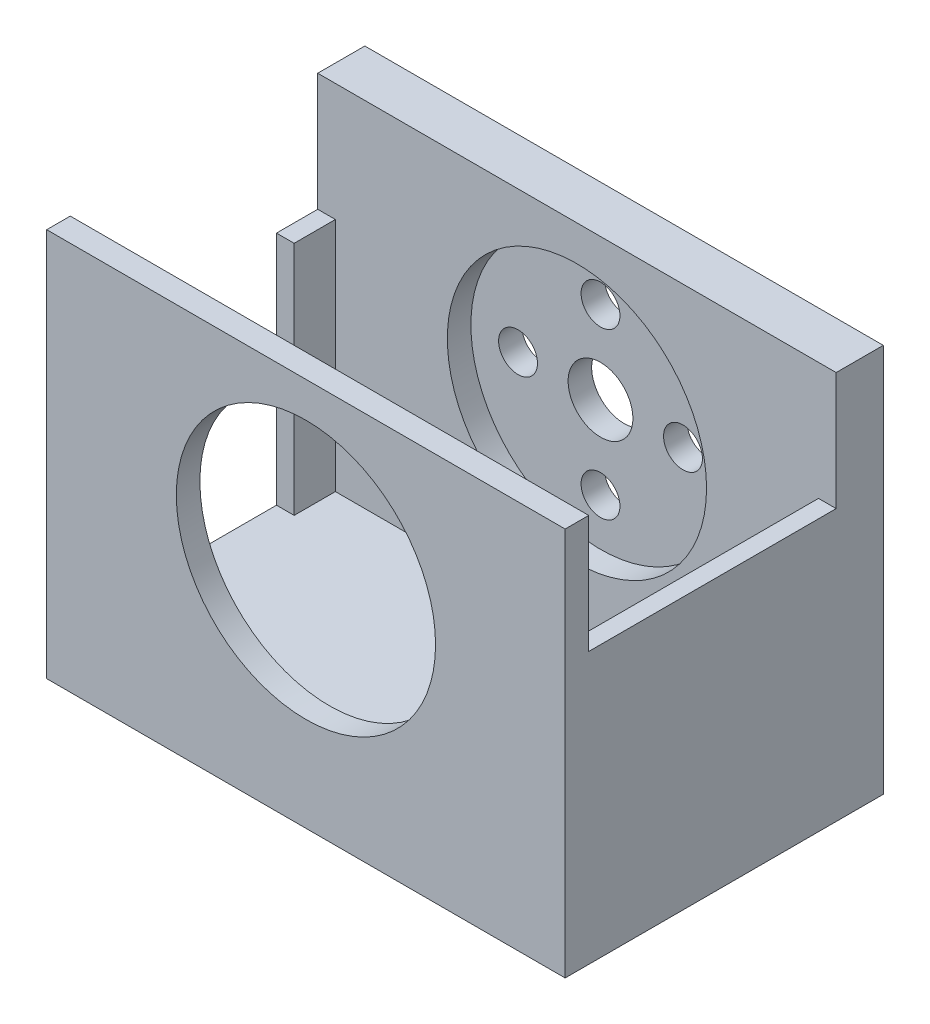
ISO-10303-21;
HEADER;
FILE_DESCRIPTION(('STEP AP214'),'2;1');
FILE_NAME('part.step','',(''),(''),'','','');
FILE_SCHEMA(('AUTOMOTIVE_DESIGN { 1 0 10303 214 1 1 1 1 }'));
ENDSEC;
DATA;
#1=APPLICATION_CONTEXT('core data for automotive mechanical design processes');
#2=APPLICATION_PROTOCOL_DEFINITION('international standard','automotive_design',2000,#1);
#3=PRODUCT_CONTEXT('',#1,'mechanical');
#4=PRODUCT('Part','Part','',(#3));
#5=PRODUCT_RELATED_PRODUCT_CATEGORY('part','',(#4));
#6=PRODUCT_DEFINITION_FORMATION('','',#4);
#7=PRODUCT_DEFINITION_CONTEXT('part definition',#1,'design');
#8=PRODUCT_DEFINITION('design','',#6,#7);
#9=PRODUCT_DEFINITION_SHAPE('','',#8);
#10=(LENGTH_UNIT() NAMED_UNIT(*) SI_UNIT(.MILLI.,.METRE.));
#11=(NAMED_UNIT(*) PLANE_ANGLE_UNIT() SI_UNIT($,.RADIAN.));
#12=(NAMED_UNIT(*) SI_UNIT($,.STERADIAN.) SOLID_ANGLE_UNIT());
#13=UNCERTAINTY_MEASURE_WITH_UNIT(LENGTH_MEASURE(1.E-05),#10,'distance_accuracy_value','');
#14=(GEOMETRIC_REPRESENTATION_CONTEXT(3) GLOBAL_UNCERTAINTY_ASSIGNED_CONTEXT((#13)) GLOBAL_UNIT_ASSIGNED_CONTEXT((#10,
#11,#12)) REPRESENTATION_CONTEXT('',''));
#15=CARTESIAN_POINT('',(0.,0.,0.));
#16=DIRECTION('',(0.,0.,1.));
#17=DIRECTION('',(1.,0.,0.));
#18=AXIS2_PLACEMENT_3D('',#15,#16,#17);
#19=CARTESIAN_POINT('',(0.,23.,0.));
#20=DIRECTION('',(0.,1.,0.));
#21=DIRECTION('',(0.,0.,1.));
#22=AXIS2_PLACEMENT_3D('',#19,#20,#21);
#23=PLANE('',#22);
#24=DIRECTION('',(1.,0.,0.));
#25=VECTOR('',#24,1.);
#26=CARTESIAN_POINT('',(0.,23.,11.5));
#27=LINE('',#26,#25);
#28=CARTESIAN_POINT('',(20.5,23.,11.5));
#29=VERTEX_POINT('',#28);
#30=CARTESIAN_POINT('',(22.,23.,11.5));
#31=VERTEX_POINT('',#30);
#32=EDGE_CURVE('E72',#29,#31,#27,.T.);
#33=ORIENTED_EDGE('',*,*,#32,.T.);
#34=DIRECTION('',(0.,0.,-1.));
#35=VECTOR('',#34,1.);
#36=CARTESIAN_POINT('',(22.,23.,-13.5));
#37=LINE('',#36,#35);
#38=CARTESIAN_POINT('',(22.,23.,-9.5));
#39=VERTEX_POINT('',#38);
#40=EDGE_CURVE('E298',#31,#39,#37,.T.);
#41=ORIENTED_EDGE('',*,*,#40,.T.);
#42=DIRECTION('',(-1.,0.,0.));
#43=VECTOR('',#42,1.);
#44=CARTESIAN_POINT('',(0.,23.,-9.5));
#45=LINE('',#44,#43);
#46=CARTESIAN_POINT('',(20.5,23.,-9.5));
#47=VERTEX_POINT('',#46);
#48=EDGE_CURVE('E57',#39,#47,#45,.T.);
#49=ORIENTED_EDGE('',*,*,#48,.T.);
#50=DIRECTION('',(0.,0.,1.));
#51=VECTOR('',#50,1.);
#52=CARTESIAN_POINT('',(20.5,23.,0.));
#53=LINE('',#52,#51);
#54=EDGE_CURVE('E263',#47,#29,#53,.T.);
#55=ORIENTED_EDGE('',*,*,#54,.T.);
#56=EDGE_LOOP('',(#33,#41,#49,#55));
#57=FACE_BOUND('',#56,.T.);
#58=ADVANCED_FACE('F45',(#57),#23,.T.);
#59=CARTESIAN_POINT('',(-22.,23.,11.5));
#60=VERTEX_POINT('',#59);
#61=CARTESIAN_POINT('',(-20.5,23.,11.5));
#62=VERTEX_POINT('',#61);
#63=EDGE_CURVE('E170',#60,#62,#27,.T.);
#64=ORIENTED_EDGE('',*,*,#63,.T.);
#65=DIRECTION('',(0.,0.,-1.));
#66=VECTOR('',#65,1.);
#67=CARTESIAN_POINT('',(-20.5,23.,0.));
#68=LINE('',#67,#66);
#69=CARTESIAN_POINT('',(-20.5,23.,8.));
#70=VERTEX_POINT('',#69);
#71=EDGE_CURVE('E275',#62,#70,#68,.T.);
#72=ORIENTED_EDGE('',*,*,#71,.T.);
#73=DIRECTION('',(1.,0.,0.));
#74=VECTOR('',#73,1.);
#75=CARTESIAN_POINT('',(-40.5,23.,8.));
#76=LINE('',#75,#74);
#77=CARTESIAN_POINT('',(-22.,23.,8.));
#78=VERTEX_POINT('',#77);
#79=EDGE_CURVE('E232',#78,#70,#76,.T.);
#80=ORIENTED_EDGE('',*,*,#79,.F.);
#81=DIRECTION('',(0.,0.,1.));
#82=VECTOR('',#81,1.);
#83=CARTESIAN_POINT('',(-22.,23.,-13.5));
#84=LINE('',#83,#82);
#85=EDGE_CURVE('E64',#78,#60,#84,.T.);
#86=ORIENTED_EDGE('',*,*,#85,.T.);
#87=EDGE_LOOP('',(#64,#72,#80,#86));
#88=FACE_BOUND('',#87,.T.);
#89=ADVANCED_FACE('F404',(#88),#23,.T.);
#90=CARTESIAN_POINT('',(-20.5,23.,-6.));
#91=VERTEX_POINT('',#90);
#92=CARTESIAN_POINT('',(-20.5,23.,-9.5));
#93=VERTEX_POINT('',#92);
#94=EDGE_CURVE('E257',#91,#93,#68,.T.);
#95=ORIENTED_EDGE('',*,*,#94,.T.);
#96=CARTESIAN_POINT('',(-22.,23.,-9.5));
#97=VERTEX_POINT('',#96);
#98=EDGE_CURVE('E11',#93,#97,#45,.T.);
#99=ORIENTED_EDGE('',*,*,#98,.T.);
#100=CARTESIAN_POINT('',(-22.,23.,-6.));
#101=VERTEX_POINT('',#100);
#102=EDGE_CURVE('E295',#97,#101,#84,.T.);
#103=ORIENTED_EDGE('',*,*,#102,.T.);
#104=DIRECTION('',(1.,0.,0.));
#105=VECTOR('',#104,1.);
#106=CARTESIAN_POINT('',(-40.5,23.,-6.));
#107=LINE('',#106,#105);
#108=EDGE_CURVE('E236',#101,#91,#107,.T.);
#109=ORIENTED_EDGE('',*,*,#108,.T.);
#110=EDGE_LOOP('',(#95,#99,#103,#109));
#111=FACE_BOUND('',#110,.T.);
#112=ADVANCED_FACE('F423',(#111),#23,.T.);
#113=CARTESIAN_POINT('',(-20.5,3.,0.));
#114=DIRECTION('',(1.,0.,0.));
#115=DIRECTION('',(0.,0.,-1.));
#116=AXIS2_PLACEMENT_3D('',#113,#114,#115);
#117=PLANE('',#116);
#118=DIRECTION('',(0.,-1.,0.));
#119=VECTOR('',#118,1.);
#120=CARTESIAN_POINT('',(-20.5,3.,8.));
#121=LINE('',#120,#119);
#122=CARTESIAN_POINT('',(-20.5,3.,8.));
#123=VERTEX_POINT('',#122);
#124=EDGE_CURVE('E223',#70,#123,#121,.T.);
#125=ORIENTED_EDGE('',*,*,#124,.F.);
#126=ORIENTED_EDGE('',*,*,#71,.F.);
#127=DIRECTION('',(0.,1.,0.));
#128=VECTOR('',#127,1.);
#129=CARTESIAN_POINT('',(-20.5,3.,11.5));
#130=LINE('',#129,#128);
#131=CARTESIAN_POINT('',(-20.5,3.,11.5));
#132=VERTEX_POINT('',#131);
#133=EDGE_CURVE('E291',#132,#62,#130,.T.);
#134=ORIENTED_EDGE('',*,*,#133,.F.);
#135=DIRECTION('',(0.,0.,-1.));
#136=VECTOR('',#135,1.);
#137=CARTESIAN_POINT('',(-20.5,3.,0.));
#138=LINE('',#137,#136);
#139=EDGE_CURVE('E264',#132,#123,#138,.T.);
#140=ORIENTED_EDGE('',*,*,#139,.T.);
#141=EDGE_LOOP('',(#125,#126,#134,#140));
#142=FACE_BOUND('',#141,.T.);
#143=ADVANCED_FACE('F409',(#142),#117,.T.);
#144=CARTESIAN_POINT('',(-22.,23.,-13.5));
#145=DIRECTION('',(1.,0.,0.));
#146=DIRECTION('',(0.,0.,-1.));
#147=AXIS2_PLACEMENT_3D('',#144,#145,#146);
#148=PLANE('',#147);
#149=ORIENTED_EDGE('',*,*,#85,.F.);
#150=DIRECTION('',(0.,-1.,0.));
#151=VECTOR('',#150,1.);
#152=CARTESIAN_POINT('',(-22.,23.,8.));
#153=LINE('',#152,#151);
#154=CARTESIAN_POINT('',(-22.,3.,8.));
#155=VERTEX_POINT('',#154);
#156=EDGE_CURVE('E253',#78,#155,#153,.T.);
#157=ORIENTED_EDGE('',*,*,#156,.T.);
#158=DIRECTION('',(0.,0.,-1.));
#159=VECTOR('',#158,1.);
#160=CARTESIAN_POINT('',(-22.,3.,-13.5));
#161=LINE('',#160,#159);
#162=CARTESIAN_POINT('',(-22.,3.,-6.));
#163=VERTEX_POINT('',#162);
#164=EDGE_CURVE('E235',#155,#163,#161,.T.);
#165=ORIENTED_EDGE('',*,*,#164,.T.);
#166=DIRECTION('',(0.,1.,0.));
#167=VECTOR('',#166,1.);
#168=CARTESIAN_POINT('',(-22.,23.,-6.));
#169=LINE('',#168,#167);
#170=EDGE_CURVE('E249',#163,#101,#169,.T.);
#171=ORIENTED_EDGE('',*,*,#170,.T.);
#172=ORIENTED_EDGE('',*,*,#102,.F.);
#173=DIRECTION('',(0.,-1.,0.));
#174=VECTOR('',#173,1.);
#175=CARTESIAN_POINT('',(-22.,33.,-9.5));
#176=LINE('',#175,#174);
#177=CARTESIAN_POINT('',(-22.,33.,-9.5));
#178=VERTEX_POINT('',#177);
#179=EDGE_CURVE('E216',#178,#97,#176,.T.);
#180=ORIENTED_EDGE('',*,*,#179,.F.);
#181=DIRECTION('',(0.,0.,-1.));
#182=VECTOR('',#181,1.);
#183=CARTESIAN_POINT('',(-22.,33.,0.));
#184=LINE('',#183,#182);
#185=CARTESIAN_POINT('',(-22.,33.,-13.5));
#186=VERTEX_POINT('',#185);
#187=EDGE_CURVE('E205',#178,#186,#184,.T.);
#188=ORIENTED_EDGE('',*,*,#187,.T.);
#189=DIRECTION('',(0.,-1.,0.));
#190=VECTOR('',#189,1.);
#191=CARTESIAN_POINT('',(-22.,23.,-13.5));
#192=LINE('',#191,#190);
#193=CARTESIAN_POINT('',(-22.,0.,-13.5));
#194=VERTEX_POINT('',#193);
#195=EDGE_CURVE('E301',#186,#194,#192,.T.);
#196=ORIENTED_EDGE('',*,*,#195,.T.);
#197=DIRECTION('',(0.,0.,1.));
#198=VECTOR('',#197,1.);
#199=CARTESIAN_POINT('',(-22.,0.,-13.5));
#200=LINE('',#199,#198);
#201=CARTESIAN_POINT('',(-22.,0.,13.5));
#202=VERTEX_POINT('',#201);
#203=EDGE_CURVE('E294',#194,#202,#200,.T.);
#204=ORIENTED_EDGE('',*,*,#203,.T.);
#205=DIRECTION('',(0.,-1.,0.));
#206=VECTOR('',#205,1.);
#207=CARTESIAN_POINT('',(-22.,23.,13.5));
#208=LINE('',#207,#206);
#209=CARTESIAN_POINT('',(-22.,33.,13.5));
#210=VERTEX_POINT('',#209);
#211=EDGE_CURVE('E55',#210,#202,#208,.T.);
#212=ORIENTED_EDGE('',*,*,#211,.F.);
#213=DIRECTION('',(0.,0.,-1.));
#214=VECTOR('',#213,1.);
#215=CARTESIAN_POINT('',(-22.,33.,0.));
#216=LINE('',#215,#214);
#217=CARTESIAN_POINT('',(-22.,33.,11.5));
#218=VERTEX_POINT('',#217);
#219=EDGE_CURVE('E182',#210,#218,#216,.T.);
#220=ORIENTED_EDGE('',*,*,#219,.T.);
#221=DIRECTION('',(0.,-1.,0.));
#222=VECTOR('',#221,1.);
#223=CARTESIAN_POINT('',(-22.,33.,11.5));
#224=LINE('',#223,#222);
#225=EDGE_CURVE('E165',#218,#60,#224,.T.);
#226=ORIENTED_EDGE('',*,*,#225,.T.);
#227=EDGE_LOOP('',(#149,#157,#165,#171,#172,#180,#188,#196,#204,#212,#220,#226));
#228=FACE_BOUND('',#227,.T.);
#229=ADVANCED_FACE('F47',(#228),#148,.F.);
#230=CARTESIAN_POINT('',(-22.,23.,13.5));
#231=DIRECTION('',(0.,0.,-1.));
#232=DIRECTION('',(-1.,0.,0.));
#233=AXIS2_PLACEMENT_3D('',#230,#231,#232);
#234=PLANE('',#233);
#235=CARTESIAN_POINT('',(0.,19.,13.5));
#236=DIRECTION('',(0.,0.,1.));
#237=DIRECTION('',(1.,0.,0.));
#238=AXIS2_PLACEMENT_3D('',#235,#236,#237);
#239=CIRCLE('',#238,11.);
#240=CARTESIAN_POINT('',(11.,19.,13.5));
#241=VERTEX_POINT('',#240);
#242=EDGE_CURVE('E330',#241,#241,#239,.T.);
#243=ORIENTED_EDGE('',*,*,#242,.F.);
#244=EDGE_LOOP('',(#243));
#245=FACE_BOUND('',#244,.T.);
#246=DIRECTION('',(1.,0.,0.));
#247=VECTOR('',#246,1.);
#248=CARTESIAN_POINT('',(-22.,0.,13.5));
#249=LINE('',#248,#247);
#250=CARTESIAN_POINT('',(22.,0.,13.5));
#251=VERTEX_POINT('',#250);
#252=EDGE_CURVE('E304',#202,#251,#249,.T.);
#253=ORIENTED_EDGE('',*,*,#252,.T.);
#254=DIRECTION('',(0.,-1.,0.));
#255=VECTOR('',#254,1.);
#256=CARTESIAN_POINT('',(22.,23.,13.5));
#257=LINE('',#256,#255);
#258=CARTESIAN_POINT('',(22.,33.,13.5));
#259=VERTEX_POINT('',#258);
#260=EDGE_CURVE('E320',#259,#251,#257,.T.);
#261=ORIENTED_EDGE('',*,*,#260,.F.);
#262=DIRECTION('',(-1.,0.,0.));
#263=VECTOR('',#262,1.);
#264=CARTESIAN_POINT('',(0.,33.,13.5));
#265=LINE('',#264,#263);
#266=EDGE_CURVE('E191',#259,#210,#265,.T.);
#267=ORIENTED_EDGE('',*,*,#266,.T.);
#268=ORIENTED_EDGE('',*,*,#211,.T.);
#269=EDGE_LOOP('',(#253,#261,#267,#268));
#270=FACE_BOUND('',#269,.T.);
#271=ADVANCED_FACE('F378',(#245,#270),#234,.F.);
#272=CARTESIAN_POINT('',(22.,23.,-13.5));
#273=DIRECTION('',(-1.,0.,0.));
#274=DIRECTION('',(0.,0.,1.));
#275=AXIS2_PLACEMENT_3D('',#272,#273,#274);
#276=PLANE('',#275);
#277=DIRECTION('',(0.,0.,-1.));
#278=VECTOR('',#277,1.);
#279=CARTESIAN_POINT('',(22.,0.,-13.5));
#280=LINE('',#279,#278);
#281=CARTESIAN_POINT('',(22.,0.,-13.5));
#282=VERTEX_POINT('',#281);
#283=EDGE_CURVE('E307',#251,#282,#280,.T.);
#284=ORIENTED_EDGE('',*,*,#283,.T.);
#285=DIRECTION('',(0.,-1.,0.));
#286=VECTOR('',#285,1.);
#287=CARTESIAN_POINT('',(22.,23.,-13.5));
#288=LINE('',#287,#286);
#289=CARTESIAN_POINT('',(22.,33.,-13.5));
#290=VERTEX_POINT('',#289);
#291=EDGE_CURVE('E316',#290,#282,#288,.T.);
#292=ORIENTED_EDGE('',*,*,#291,.F.);
#293=DIRECTION('',(0.,0.,1.));
#294=VECTOR('',#293,1.);
#295=CARTESIAN_POINT('',(22.,33.,0.));
#296=LINE('',#295,#294);
#297=CARTESIAN_POINT('',(22.,33.,-9.5));
#298=VERTEX_POINT('',#297);
#299=EDGE_CURVE('E213',#290,#298,#296,.T.);
#300=ORIENTED_EDGE('',*,*,#299,.T.);
#301=DIRECTION('',(0.,-1.,0.));
#302=VECTOR('',#301,1.);
#303=CARTESIAN_POINT('',(22.,33.,-9.5));
#304=LINE('',#303,#302);
#305=EDGE_CURVE('E219',#298,#39,#304,.T.);
#306=ORIENTED_EDGE('',*,*,#305,.T.);
#307=ORIENTED_EDGE('',*,*,#40,.F.);
#308=DIRECTION('',(0.,-1.,0.));
#309=VECTOR('',#308,1.);
#310=CARTESIAN_POINT('',(22.,33.,11.5));
#311=LINE('',#310,#309);
#312=CARTESIAN_POINT('',(22.,33.,11.5));
#313=VERTEX_POINT('',#312);
#314=EDGE_CURVE('E174',#313,#31,#311,.T.);
#315=ORIENTED_EDGE('',*,*,#314,.F.);
#316=DIRECTION('',(0.,0.,1.));
#317=VECTOR('',#316,1.);
#318=CARTESIAN_POINT('',(22.,33.,0.));
#319=LINE('',#318,#317);
#320=EDGE_CURVE('E184',#313,#259,#319,.T.);
#321=ORIENTED_EDGE('',*,*,#320,.T.);
#322=ORIENTED_EDGE('',*,*,#260,.T.);
#323=EDGE_LOOP('',(#284,#292,#300,#306,#307,#315,#321,#322));
#324=FACE_BOUND('',#323,.T.);
#325=ADVANCED_FACE('F381',(#324),#276,.F.);
#326=CARTESIAN_POINT('',(-22.,23.,-13.5));
#327=DIRECTION('',(0.,0.,1.));
#328=DIRECTION('',(1.,0.,0.));
#329=AXIS2_PLACEMENT_3D('',#326,#327,#328);
#330=PLANE('',#329);
#331=CARTESIAN_POINT('',(-7.,19.,-13.5));
#332=DIRECTION('',(0.,0.,1.));
#333=DIRECTION('',(1.,0.,0.));
#334=AXIS2_PLACEMENT_3D('',#331,#332,#333);
#335=CIRCLE('',#334,1.65);
#336=CARTESIAN_POINT('',(-5.35,19.,-13.5));
#337=VERTEX_POINT('',#336);
#338=EDGE_CURVE('E336',#337,#337,#335,.T.);
#339=ORIENTED_EDGE('',*,*,#338,.T.);
#340=EDGE_LOOP('',(#339));
#341=FACE_BOUND('',#340,.T.);
#342=CARTESIAN_POINT('',(0.,12.,-13.5));
#343=DIRECTION('',(0.,0.,1.));
#344=DIRECTION('',(1.,0.,0.));
#345=AXIS2_PLACEMENT_3D('',#342,#343,#344);
#346=CIRCLE('',#345,1.65);
#347=CARTESIAN_POINT('',(1.64999999999993,12.,-13.5));
#348=VERTEX_POINT('',#347);
#349=EDGE_CURVE('E678',#348,#348,#346,.T.);
#350=ORIENTED_EDGE('',*,*,#349,.T.);
#351=EDGE_LOOP('',(#350));
#352=FACE_BOUND('',#351,.T.);
#353=CARTESIAN_POINT('',(7.,19.,-13.5));
#354=DIRECTION('',(0.,0.,1.));
#355=DIRECTION('',(1.,0.,0.));
#356=AXIS2_PLACEMENT_3D('',#353,#354,#355);
#357=CIRCLE('',#356,1.65);
#358=CARTESIAN_POINT('',(8.65,19.,-13.5));
#359=VERTEX_POINT('',#358);
#360=EDGE_CURVE('E674',#359,#359,#357,.T.);
#361=ORIENTED_EDGE('',*,*,#360,.T.);
#362=EDGE_LOOP('',(#361));
#363=FACE_BOUND('',#362,.T.);
#364=CARTESIAN_POINT('',(0.,26.,-13.5));
#365=DIRECTION('',(0.,0.,1.));
#366=DIRECTION('',(1.,0.,0.));
#367=AXIS2_PLACEMENT_3D('',#364,#365,#366);
#368=CIRCLE('',#367,1.65);
#369=CARTESIAN_POINT('',(1.65000000000002,26.,-13.5));
#370=VERTEX_POINT('',#369);
#371=EDGE_CURVE('E362',#370,#370,#368,.T.);
#372=ORIENTED_EDGE('',*,*,#371,.T.);
#373=EDGE_LOOP('',(#372));
#374=FACE_BOUND('',#373,.T.);
#375=CARTESIAN_POINT('',(0.,19.,-13.5));
#376=DIRECTION('',(0.,0.,1.));
#377=DIRECTION('',(1.,0.,0.));
#378=AXIS2_PLACEMENT_3D('',#375,#376,#377);
#379=CIRCLE('',#378,2.75);
#380=CARTESIAN_POINT('',(2.75,19.,-13.5));
#381=VERTEX_POINT('',#380);
#382=EDGE_CURVE('E669',#381,#381,#379,.T.);
#383=ORIENTED_EDGE('',*,*,#382,.T.);
#384=EDGE_LOOP('',(#383));
#385=FACE_BOUND('',#384,.T.);
#386=DIRECTION('',(-1.,0.,0.));
#387=VECTOR('',#386,1.);
#388=CARTESIAN_POINT('',(-22.,0.,-13.5));
#389=LINE('',#388,#387);
#390=EDGE_CURVE('E310',#282,#194,#389,.T.);
#391=ORIENTED_EDGE('',*,*,#390,.T.);
#392=ORIENTED_EDGE('',*,*,#195,.F.);
#393=DIRECTION('',(1.,0.,0.));
#394=VECTOR('',#393,1.);
#395=CARTESIAN_POINT('',(0.,33.,-13.5));
#396=LINE('',#395,#394);
#397=EDGE_CURVE('E209',#186,#290,#396,.T.);
#398=ORIENTED_EDGE('',*,*,#397,.T.);
#399=ORIENTED_EDGE('',*,*,#291,.T.);
#400=EDGE_LOOP('',(#391,#392,#398,#399));
#401=FACE_BOUND('',#400,.T.);
#402=ADVANCED_FACE('F389',(#341,#352,#363,#374,#385,#401),#330,.F.);
#403=CARTESIAN_POINT('',(0.,0.,0.));
#404=DIRECTION('',(0.,1.,0.));
#405=DIRECTION('',(0.,0.,1.));
#406=AXIS2_PLACEMENT_3D('',#403,#404,#405);
#407=PLANE('',#406);
#408=ORIENTED_EDGE('',*,*,#203,.F.);
#409=ORIENTED_EDGE('',*,*,#390,.F.);
#410=ORIENTED_EDGE('',*,*,#283,.F.);
#411=ORIENTED_EDGE('',*,*,#252,.F.);
#412=EDGE_LOOP('',(#408,#409,#410,#411));
#413=FACE_BOUND('',#412,.T.);
#414=ADVANCED_FACE('F387',(#413),#407,.F.);
#415=CARTESIAN_POINT('',(0.,3.,11.5));
#416=DIRECTION('',(0.,0.,-1.));
#417=DIRECTION('',(-1.,0.,0.));
#418=AXIS2_PLACEMENT_3D('',#415,#416,#417);
#419=PLANE('',#418);
#420=CARTESIAN_POINT('',(0.,19.,11.5));
#421=DIRECTION('',(0.,0.,-1.));
#422=DIRECTION('',(-1.,0.,0.));
#423=AXIS2_PLACEMENT_3D('',#420,#421,#422);
#424=CIRCLE('',#423,11.);
#425=CARTESIAN_POINT('',(-11.,19.,11.5));
#426=VERTEX_POINT('',#425);
#427=EDGE_CURVE('E175',#426,#426,#424,.F.);
#428=ORIENTED_EDGE('',*,*,#427,.T.);
#429=EDGE_LOOP('',(#428));
#430=FACE_BOUND('',#429,.T.);
#431=ORIENTED_EDGE('',*,*,#133,.T.);
#432=ORIENTED_EDGE('',*,*,#63,.F.);
#433=ORIENTED_EDGE('',*,*,#225,.F.);
#434=DIRECTION('',(1.,0.,0.));
#435=VECTOR('',#434,1.);
#436=CARTESIAN_POINT('',(0.,33.,11.5));
#437=LINE('',#436,#435);
#438=EDGE_CURVE('E169',#218,#313,#437,.T.);
#439=ORIENTED_EDGE('',*,*,#438,.T.);
#440=ORIENTED_EDGE('',*,*,#314,.T.);
#441=ORIENTED_EDGE('',*,*,#32,.F.);
#442=DIRECTION('',(0.,1.,0.));
#443=VECTOR('',#442,1.);
#444=CARTESIAN_POINT('',(20.5,3.,11.5));
#445=LINE('',#444,#443);
#446=CARTESIAN_POINT('',(20.5,3.,11.5));
#447=VERTEX_POINT('',#446);
#448=EDGE_CURVE('E274',#447,#29,#445,.T.);
#449=ORIENTED_EDGE('',*,*,#448,.F.);
#450=DIRECTION('',(-1.,0.,0.));
#451=VECTOR('',#450,1.);
#452=CARTESIAN_POINT('',(0.,3.,11.5));
#453=LINE('',#452,#451);
#454=EDGE_CURVE('E258',#447,#132,#453,.T.);
#455=ORIENTED_EDGE('',*,*,#454,.T.);
#456=EDGE_LOOP('',(#431,#432,#433,#439,#440,#441,#449,#455));
#457=FACE_BOUND('',#456,.T.);
#458=ADVANCED_FACE('F167',(#430,#457),#419,.T.);
#459=DIRECTION('',(0.,1.,0.));
#460=VECTOR('',#459,1.);
#461=CARTESIAN_POINT('',(-20.5,3.,-6.));
#462=LINE('',#461,#460);
#463=CARTESIAN_POINT('',(-20.5,3.,-6.));
#464=VERTEX_POINT('',#463);
#465=EDGE_CURVE('E228',#464,#91,#462,.T.);
#466=ORIENTED_EDGE('',*,*,#465,.F.);
#467=CARTESIAN_POINT('',(-20.5,3.,-9.5));
#468=VERTEX_POINT('',#467);
#469=EDGE_CURVE('E262',#464,#468,#138,.T.);
#470=ORIENTED_EDGE('',*,*,#469,.T.);
#471=DIRECTION('',(0.,1.,0.));
#472=VECTOR('',#471,1.);
#473=CARTESIAN_POINT('',(-20.5,3.,-9.5));
#474=LINE('',#473,#472);
#475=EDGE_CURVE('E287',#468,#93,#474,.T.);
#476=ORIENTED_EDGE('',*,*,#475,.T.);
#477=ORIENTED_EDGE('',*,*,#94,.F.);
#478=EDGE_LOOP('',(#466,#470,#476,#477));
#479=FACE_BOUND('',#478,.T.);
#480=ADVANCED_FACE('F428',(#479),#117,.T.);
#481=CARTESIAN_POINT('',(0.,3.,-9.5));
#482=DIRECTION('',(0.,0.,1.));
#483=DIRECTION('',(1.,0.,0.));
#484=AXIS2_PLACEMENT_3D('',#481,#482,#483);
#485=PLANE('',#484);
#486=CARTESIAN_POINT('',(0.,19.,-9.5));
#487=DIRECTION('',(0.,0.,1.));
#488=DIRECTION('',(1.,0.,0.));
#489=AXIS2_PLACEMENT_3D('',#486,#487,#488);
#490=CIRCLE('',#489,11.);
#491=CARTESIAN_POINT('',(11.,19.,-9.5));
#492=VERTEX_POINT('',#491);
#493=EDGE_CURVE('E326',#492,#492,#490,.F.);
#494=ORIENTED_EDGE('',*,*,#493,.T.);
#495=EDGE_LOOP('',(#494));
#496=FACE_BOUND('',#495,.T.);
#497=DIRECTION('',(0.,1.,0.));
#498=VECTOR('',#497,1.);
#499=CARTESIAN_POINT('',(20.5,3.,-9.5));
#500=LINE('',#499,#498);
#501=CARTESIAN_POINT('',(20.5,3.,-9.5));
#502=VERTEX_POINT('',#501);
#503=EDGE_CURVE('E283',#502,#47,#500,.T.);
#504=ORIENTED_EDGE('',*,*,#503,.T.);
#505=ORIENTED_EDGE('',*,*,#48,.F.);
#506=ORIENTED_EDGE('',*,*,#305,.F.);
#507=DIRECTION('',(-1.,0.,0.));
#508=VECTOR('',#507,1.);
#509=CARTESIAN_POINT('',(0.,33.,-9.5));
#510=LINE('',#509,#508);
#511=EDGE_CURVE('E201',#298,#178,#510,.T.);
#512=ORIENTED_EDGE('',*,*,#511,.T.);
#513=ORIENTED_EDGE('',*,*,#179,.T.);
#514=ORIENTED_EDGE('',*,*,#98,.F.);
#515=ORIENTED_EDGE('',*,*,#475,.F.);
#516=DIRECTION('',(1.,0.,0.));
#517=VECTOR('',#516,1.);
#518=CARTESIAN_POINT('',(0.,3.,-9.5));
#519=LINE('',#518,#517);
#520=EDGE_CURVE('E268',#468,#502,#519,.T.);
#521=ORIENTED_EDGE('',*,*,#520,.T.);
#522=EDGE_LOOP('',(#504,#505,#506,#512,#513,#514,#515,#521));
#523=FACE_BOUND('',#522,.T.);
#524=ADVANCED_FACE('F398',(#496,#523),#485,.T.);
#525=CARTESIAN_POINT('',(20.5,3.,0.));
#526=DIRECTION('',(-1.,0.,0.));
#527=DIRECTION('',(0.,0.,1.));
#528=AXIS2_PLACEMENT_3D('',#525,#526,#527);
#529=PLANE('',#528);
#530=ORIENTED_EDGE('',*,*,#54,.F.);
#531=ORIENTED_EDGE('',*,*,#503,.F.);
#532=DIRECTION('',(0.,0.,1.));
#533=VECTOR('',#532,1.);
#534=CARTESIAN_POINT('',(20.5,3.,0.));
#535=LINE('',#534,#533);
#536=EDGE_CURVE('E271',#502,#447,#535,.T.);
#537=ORIENTED_EDGE('',*,*,#536,.T.);
#538=ORIENTED_EDGE('',*,*,#448,.T.);
#539=EDGE_LOOP('',(#530,#531,#537,#538));
#540=FACE_BOUND('',#539,.T.);
#541=ADVANCED_FACE('F434',(#540),#529,.T.);
#542=CARTESIAN_POINT('',(0.,3.,0.));
#543=DIRECTION('',(0.,-1.,0.));
#544=DIRECTION('',(0.,0.,-1.));
#545=AXIS2_PLACEMENT_3D('',#542,#543,#544);
#546=PLANE('',#545);
#547=ORIENTED_EDGE('',*,*,#454,.F.);
#548=ORIENTED_EDGE('',*,*,#536,.F.);
#549=ORIENTED_EDGE('',*,*,#520,.F.);
#550=ORIENTED_EDGE('',*,*,#469,.F.);
#551=DIRECTION('',(1.,0.,0.));
#552=VECTOR('',#551,1.);
#553=CARTESIAN_POINT('',(-40.5,3.,-6.));
#554=LINE('',#553,#552);
#555=EDGE_CURVE('E240',#163,#464,#554,.T.);
#556=ORIENTED_EDGE('',*,*,#555,.F.);
#557=ORIENTED_EDGE('',*,*,#164,.F.);
#558=DIRECTION('',(1.,0.,0.));
#559=VECTOR('',#558,1.);
#560=CARTESIAN_POINT('',(-40.5,3.,8.));
#561=LINE('',#560,#559);
#562=EDGE_CURVE('E231',#155,#123,#561,.T.);
#563=ORIENTED_EDGE('',*,*,#562,.T.);
#564=ORIENTED_EDGE('',*,*,#139,.F.);
#565=EDGE_LOOP('',(#547,#548,#549,#550,#556,#557,#563,#564));
#566=FACE_BOUND('',#565,.T.);
#567=ADVANCED_FACE('F414',(#566),#546,.F.);
#568=CARTESIAN_POINT('',(-40.5,3.,8.));
#569=DIRECTION('',(0.,0.,1.));
#570=DIRECTION('',(0.,-1.,0.));
#571=AXIS2_PLACEMENT_3D('',#568,#569,#570);
#572=PLANE('',#571);
#573=ORIENTED_EDGE('',*,*,#79,.T.);
#574=ORIENTED_EDGE('',*,*,#124,.T.);
#575=ORIENTED_EDGE('',*,*,#562,.F.);
#576=ORIENTED_EDGE('',*,*,#156,.F.);
#577=EDGE_LOOP('',(#573,#574,#575,#576));
#578=FACE_BOUND('',#577,.T.);
#579=ADVANCED_FACE('F412',(#578),#572,.F.);
#580=CARTESIAN_POINT('',(-40.5,3.,-6.));
#581=DIRECTION('',(0.,0.,-1.));
#582=DIRECTION('',(0.,1.,0.));
#583=AXIS2_PLACEMENT_3D('',#580,#581,#582);
#584=PLANE('',#583);
#585=ORIENTED_EDGE('',*,*,#555,.T.);
#586=ORIENTED_EDGE('',*,*,#465,.T.);
#587=ORIENTED_EDGE('',*,*,#108,.F.);
#588=ORIENTED_EDGE('',*,*,#170,.F.);
#589=EDGE_LOOP('',(#585,#586,#587,#588));
#590=FACE_BOUND('',#589,.T.);
#591=ADVANCED_FACE('F558',(#590),#584,.F.);
#592=CARTESIAN_POINT('',(0.,33.,0.));
#593=DIRECTION('',(0.,-1.,0.));
#594=DIRECTION('',(0.,0.,-1.));
#595=AXIS2_PLACEMENT_3D('',#592,#593,#594);
#596=PLANE('',#595);
#597=ORIENTED_EDGE('',*,*,#511,.F.);
#598=ORIENTED_EDGE('',*,*,#299,.F.);
#599=ORIENTED_EDGE('',*,*,#397,.F.);
#600=ORIENTED_EDGE('',*,*,#187,.F.);
#601=EDGE_LOOP('',(#597,#598,#599,#600));
#602=FACE_BOUND('',#601,.T.);
#603=ADVANCED_FACE('F395',(#602),#596,.F.);
#604=CARTESIAN_POINT('',(0.,33.,0.));
#605=DIRECTION('',(0.,-1.,0.));
#606=DIRECTION('',(0.,0.,-1.));
#607=AXIS2_PLACEMENT_3D('',#604,#605,#606);
#608=PLANE('',#607);
#609=ORIENTED_EDGE('',*,*,#438,.F.);
#610=ORIENTED_EDGE('',*,*,#219,.F.);
#611=ORIENTED_EDGE('',*,*,#266,.F.);
#612=ORIENTED_EDGE('',*,*,#320,.F.);
#613=EDGE_LOOP('',(#609,#610,#611,#612));
#614=FACE_BOUND('',#613,.T.);
#615=ADVANCED_FACE('F180',(#614),#608,.F.);
#616=CARTESIAN_POINT('',(0.,19.,-11.5));
#617=DIRECTION('',(0.,0.,1.));
#618=DIRECTION('',(1.,0.,0.));
#619=AXIS2_PLACEMENT_3D('',#616,#617,#618);
#620=PLANE('',#619);
#621=CARTESIAN_POINT('',(-7.,19.,-11.5));
#622=DIRECTION('',(0.,0.,1.));
#623=DIRECTION('',(1.,0.,0.));
#624=AXIS2_PLACEMENT_3D('',#621,#622,#623);
#625=CIRCLE('',#624,1.65);
#626=CARTESIAN_POINT('',(-5.35,19.,-11.5));
#627=VERTEX_POINT('',#626);
#628=EDGE_CURVE('E49',#627,#627,#625,.F.);
#629=ORIENTED_EDGE('',*,*,#628,.T.);
#630=EDGE_LOOP('',(#629));
#631=FACE_BOUND('',#630,.T.);
#632=CARTESIAN_POINT('',(0.,12.,-11.5));
#633=DIRECTION('',(0.,0.,1.));
#634=DIRECTION('',(1.,0.,0.));
#635=AXIS2_PLACEMENT_3D('',#632,#633,#634);
#636=CIRCLE('',#635,1.65);
#637=CARTESIAN_POINT('',(1.64999999999993,12.,-11.5));
#638=VERTEX_POINT('',#637);
#639=EDGE_CURVE('E343',#638,#638,#636,.F.);
#640=ORIENTED_EDGE('',*,*,#639,.T.);
#641=EDGE_LOOP('',(#640));
#642=FACE_BOUND('',#641,.T.);
#643=CARTESIAN_POINT('',(7.,19.,-11.5));
#644=DIRECTION('',(0.,0.,1.));
#645=DIRECTION('',(1.,0.,0.));
#646=AXIS2_PLACEMENT_3D('',#643,#644,#645);
#647=CIRCLE('',#646,1.65);
#648=CARTESIAN_POINT('',(8.65,19.,-11.5));
#649=VERTEX_POINT('',#648);
#650=EDGE_CURVE('E340',#649,#649,#647,.F.);
#651=ORIENTED_EDGE('',*,*,#650,.T.);
#652=EDGE_LOOP('',(#651));
#653=FACE_BOUND('',#652,.T.);
#654=CARTESIAN_POINT('',(0.,26.,-11.5));
#655=DIRECTION('',(0.,0.,1.));
#656=DIRECTION('',(1.,0.,0.));
#657=AXIS2_PLACEMENT_3D('',#654,#655,#656);
#658=CIRCLE('',#657,1.65);
#659=CARTESIAN_POINT('',(1.65000000000002,26.,-11.5));
#660=VERTEX_POINT('',#659);
#661=EDGE_CURVE('E335',#660,#660,#658,.F.);
#662=ORIENTED_EDGE('',*,*,#661,.T.);
#663=EDGE_LOOP('',(#662));
#664=FACE_BOUND('',#663,.T.);
#665=CARTESIAN_POINT('',(0.,19.,-11.5));
#666=DIRECTION('',(0.,0.,1.));
#667=DIRECTION('',(1.,0.,0.));
#668=AXIS2_PLACEMENT_3D('',#665,#666,#667);
#669=CIRCLE('',#668,2.75);
#670=CARTESIAN_POINT('',(2.75,19.,-11.5));
#671=VERTEX_POINT('',#670);
#672=EDGE_CURVE('E331',#671,#671,#669,.F.);
#673=ORIENTED_EDGE('',*,*,#672,.T.);
#674=EDGE_LOOP('',(#673));
#675=FACE_BOUND('',#674,.T.);
#676=CARTESIAN_POINT('',(0.,19.,-11.5));
#677=DIRECTION('',(0.,0.,1.));
#678=DIRECTION('',(1.,0.,0.));
#679=AXIS2_PLACEMENT_3D('',#676,#677,#678);
#680=CIRCLE('',#679,11.);
#681=CARTESIAN_POINT('',(11.,19.,-11.5));
#682=VERTEX_POINT('',#681);
#683=EDGE_CURVE('E350',#682,#682,#680,.T.);
#684=ORIENTED_EDGE('',*,*,#683,.T.);
#685=EDGE_LOOP('',(#684));
#686=FACE_BOUND('',#685,.T.);
#687=ADVANCED_FACE('F589',(#631,#642,#653,#664,#675,#686),#620,.T.);
#688=CARTESIAN_POINT('',(0.,19.,13.5));
#689=DIRECTION('',(0.,0.,-1.));
#690=DIRECTION('',(-1.,0.,0.));
#691=AXIS2_PLACEMENT_3D('',#688,#689,#690);
#692=CYLINDRICAL_SURFACE('',#691,11.);
#693=ORIENTED_EDGE('',*,*,#493,.F.);
#694=EDGE_LOOP('',(#693));
#695=FACE_BOUND('',#694,.T.);
#696=ORIENTED_EDGE('',*,*,#683,.F.);
#697=EDGE_LOOP('',(#696));
#698=FACE_BOUND('',#697,.T.);
#699=ADVANCED_FACE('F374',(#695,#698),#692,.F.);
#700=ORIENTED_EDGE('',*,*,#427,.F.);
#701=EDGE_LOOP('',(#700));
#702=FACE_BOUND('',#701,.T.);
#703=ORIENTED_EDGE('',*,*,#242,.T.);
#704=EDGE_LOOP('',(#703));
#705=FACE_BOUND('',#704,.T.);
#706=ADVANCED_FACE('F370',(#702,#705),#692,.F.);
#707=CARTESIAN_POINT('',(0.,19.,13.5));
#708=DIRECTION('',(0.,0.,-1.));
#709=DIRECTION('',(-1.,0.,0.));
#710=AXIS2_PLACEMENT_3D('',#707,#708,#709);
#711=CYLINDRICAL_SURFACE('',#710,2.75);
#712=ORIENTED_EDGE('',*,*,#672,.F.);
#713=EDGE_LOOP('',(#712));
#714=FACE_BOUND('',#713,.T.);
#715=ORIENTED_EDGE('',*,*,#382,.F.);
#716=EDGE_LOOP('',(#715));
#717=FACE_BOUND('',#716,.T.);
#718=ADVANCED_FACE('F373',(#714,#717),#711,.F.);
#719=CARTESIAN_POINT('',(0.,26.,13.5));
#720=DIRECTION('',(0.,0.,-1.));
#721=DIRECTION('',(-1.,0.,0.));
#722=AXIS2_PLACEMENT_3D('',#719,#720,#721);
#723=CYLINDRICAL_SURFACE('',#722,1.65);
#724=ORIENTED_EDGE('',*,*,#661,.F.);
#725=EDGE_LOOP('',(#724));
#726=FACE_BOUND('',#725,.T.);
#727=ORIENTED_EDGE('',*,*,#371,.F.);
#728=EDGE_LOOP('',(#727));
#729=FACE_BOUND('',#728,.T.);
#730=ADVANCED_FACE('F616',(#726,#729),#723,.F.);
#731=CARTESIAN_POINT('',(7.,19.,13.5));
#732=DIRECTION('',(0.,0.,-1.));
#733=DIRECTION('',(-1.,0.,0.));
#734=AXIS2_PLACEMENT_3D('',#731,#732,#733);
#735=CYLINDRICAL_SURFACE('',#734,1.65);
#736=ORIENTED_EDGE('',*,*,#650,.F.);
#737=EDGE_LOOP('',(#736));
#738=FACE_BOUND('',#737,.T.);
#739=ORIENTED_EDGE('',*,*,#360,.F.);
#740=EDGE_LOOP('',(#739));
#741=FACE_BOUND('',#740,.T.);
#742=ADVANCED_FACE('F625',(#738,#741),#735,.F.);
#743=CARTESIAN_POINT('',(0.,12.,13.5));
#744=DIRECTION('',(0.,0.,-1.));
#745=DIRECTION('',(-1.,0.,0.));
#746=AXIS2_PLACEMENT_3D('',#743,#744,#745);
#747=CYLINDRICAL_SURFACE('',#746,1.65);
#748=ORIENTED_EDGE('',*,*,#639,.F.);
#749=EDGE_LOOP('',(#748));
#750=FACE_BOUND('',#749,.T.);
#751=ORIENTED_EDGE('',*,*,#349,.F.);
#752=EDGE_LOOP('',(#751));
#753=FACE_BOUND('',#752,.T.);
#754=ADVANCED_FACE('F634',(#750,#753),#747,.F.);
#755=CARTESIAN_POINT('',(-7.,19.,13.5));
#756=DIRECTION('',(0.,0.,-1.));
#757=DIRECTION('',(-1.,0.,0.));
#758=AXIS2_PLACEMENT_3D('',#755,#756,#757);
#759=CYLINDRICAL_SURFACE('',#758,1.65);
#760=ORIENTED_EDGE('',*,*,#628,.F.);
#761=EDGE_LOOP('',(#760));
#762=FACE_BOUND('',#761,.T.);
#763=ORIENTED_EDGE('',*,*,#338,.F.);
#764=EDGE_LOOP('',(#763));
#765=FACE_BOUND('',#764,.T.);
#766=ADVANCED_FACE('F643',(#762,#765),#759,.F.);
#767=CLOSED_SHELL('',(#58,#89,#112,#143,#229,#271,#325,#402,#414,#458,#480,#524,#541,#567,#579,
#591,#603,#615,#687,#699,#706,#718,#730,#742,#754,#766));
#768=MANIFOLD_SOLID_BREP('B2',#767);
#769=ADVANCED_BREP_SHAPE_REPRESENTATION('',(#18,#768),#14);
#770=SHAPE_DEFINITION_REPRESENTATION(#9,#769);
ENDSEC;
END-ISO-10303-21;
